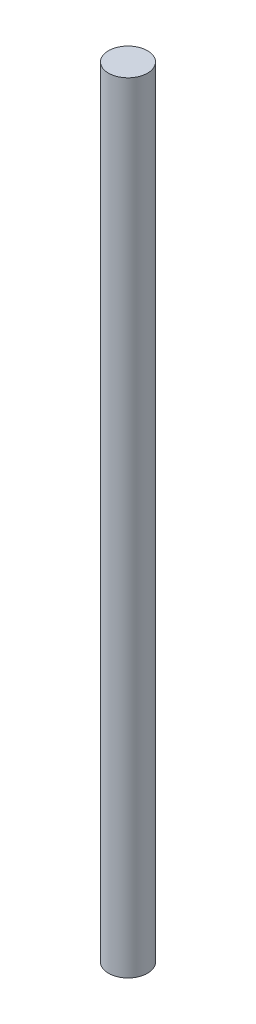
ISO-10303-21;
HEADER;
FILE_DESCRIPTION(('STEP AP214'),'2;1');
FILE_NAME('part.step','',(''),(''),'','','');
FILE_SCHEMA(('AUTOMOTIVE_DESIGN { 1 0 10303 214 1 1 1 1 }'));
ENDSEC;
DATA;
#1=APPLICATION_CONTEXT('core data for automotive mechanical design processes');
#2=APPLICATION_PROTOCOL_DEFINITION('international standard','automotive_design',2000,#1);
#3=PRODUCT_CONTEXT('',#1,'mechanical');
#4=PRODUCT('Part','Part','',(#3));
#5=PRODUCT_RELATED_PRODUCT_CATEGORY('part','',(#4));
#6=PRODUCT_DEFINITION_FORMATION('','',#4);
#7=PRODUCT_DEFINITION_CONTEXT('part definition',#1,'design');
#8=PRODUCT_DEFINITION('design','',#6,#7);
#9=PRODUCT_DEFINITION_SHAPE('','',#8);
#10=(LENGTH_UNIT() NAMED_UNIT(*) SI_UNIT(.MILLI.,.METRE.));
#11=(NAMED_UNIT(*) PLANE_ANGLE_UNIT() SI_UNIT($,.RADIAN.));
#12=(NAMED_UNIT(*) SI_UNIT($,.STERADIAN.) SOLID_ANGLE_UNIT());
#13=UNCERTAINTY_MEASURE_WITH_UNIT(LENGTH_MEASURE(1.E-05),#10,'distance_accuracy_value','');
#14=(GEOMETRIC_REPRESENTATION_CONTEXT(3) GLOBAL_UNCERTAINTY_ASSIGNED_CONTEXT((#13)) GLOBAL_UNIT_ASSIGNED_CONTEXT((#10,
#11,#12)) REPRESENTATION_CONTEXT('',''));
#15=CARTESIAN_POINT('',(0.,0.,0.));
#16=DIRECTION('',(0.,0.,1.));
#17=DIRECTION('',(1.,0.,0.));
#18=AXIS2_PLACEMENT_3D('',#15,#16,#17);
#19=CARTESIAN_POINT('',(0.,32.,0.));
#20=DIRECTION('',(0.,-1.,0.));
#21=DIRECTION('',(0.,0.,-1.));
#22=AXIS2_PLACEMENT_3D('',#19,#20,#21);
#23=CYLINDRICAL_SURFACE('',#22,0.8);
#24=CARTESIAN_POINT('',(0.,32.,0.));
#25=DIRECTION('',(0.,1.,0.));
#26=DIRECTION('',(0.,0.,1.));
#27=AXIS2_PLACEMENT_3D('',#24,#25,#26);
#28=CIRCLE('',#27,0.8);
#29=CARTESIAN_POINT('',(0.,32.,0.8));
#30=VERTEX_POINT('',#29);
#31=EDGE_CURVE('E10',#30,#30,#28,.T.);
#32=ORIENTED_EDGE('',*,*,#31,.F.);
#33=EDGE_LOOP('',(#32));
#34=FACE_BOUND('',#33,.T.);
#35=CARTESIAN_POINT('',(0.,0.,0.));
#36=DIRECTION('',(0.,1.,0.));
#37=DIRECTION('',(0.,0.,1.));
#38=AXIS2_PLACEMENT_3D('',#35,#36,#37);
#39=CIRCLE('',#38,0.8);
#40=CARTESIAN_POINT('',(0.,0.,0.8));
#41=VERTEX_POINT('',#40);
#42=EDGE_CURVE('E33',#41,#41,#39,.T.);
#43=ORIENTED_EDGE('',*,*,#42,.T.);
#44=EDGE_LOOP('',(#43));
#45=FACE_BOUND('',#44,.T.);
#46=ADVANCED_FACE('F30',(#34,#45),#23,.T.);
#47=CARTESIAN_POINT('',(0.,32.,0.));
#48=DIRECTION('',(0.,1.,0.));
#49=DIRECTION('',(0.,0.,1.));
#50=AXIS2_PLACEMENT_3D('',#47,#48,#49);
#51=PLANE('',#50);
#52=ORIENTED_EDGE('',*,*,#31,.T.);
#53=EDGE_LOOP('',(#52));
#54=FACE_BOUND('',#53,.T.);
#55=ADVANCED_FACE('F45',(#54),#51,.T.);
#56=CARTESIAN_POINT('',(0.,0.,0.));
#57=DIRECTION('',(0.,1.,0.));
#58=DIRECTION('',(0.,0.,1.));
#59=AXIS2_PLACEMENT_3D('',#56,#57,#58);
#60=PLANE('',#59);
#61=ORIENTED_EDGE('',*,*,#42,.F.);
#62=EDGE_LOOP('',(#61));
#63=FACE_BOUND('',#62,.T.);
#64=ADVANCED_FACE('F43',(#63),#60,.F.);
#65=CLOSED_SHELL('',(#46,#55,#64));
#66=MANIFOLD_SOLID_BREP('B2',#65);
#67=ADVANCED_BREP_SHAPE_REPRESENTATION('',(#18,#66),#14);
#68=SHAPE_DEFINITION_REPRESENTATION(#9,#67);
ENDSEC;
END-ISO-10303-21;
